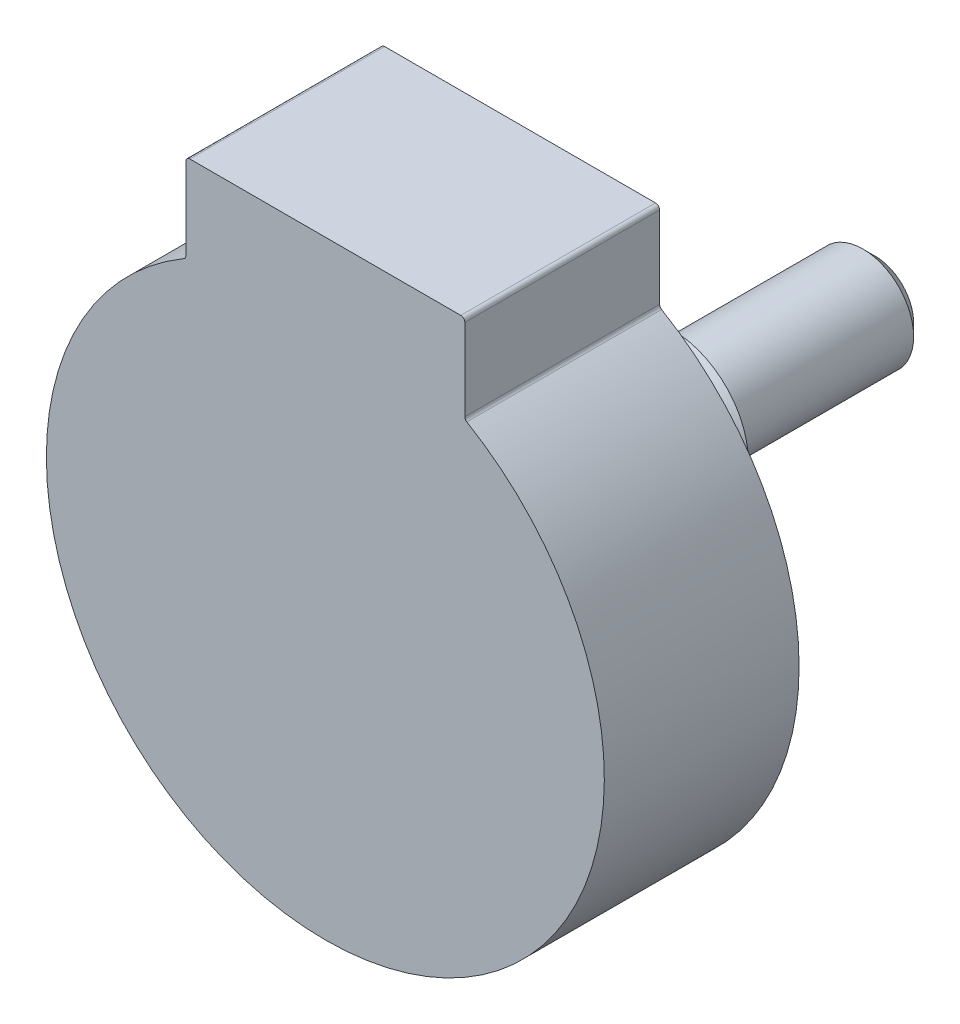
ISO-10303-21;
HEADER;
FILE_DESCRIPTION(('STEP AP214'),'2;1');
FILE_NAME('part.step','',(''),(''),'','','');
FILE_SCHEMA(('AUTOMOTIVE_DESIGN { 1 0 10303 214 1 1 1 1 }'));
ENDSEC;
DATA;
#1=APPLICATION_CONTEXT('core data for automotive mechanical design processes');
#2=APPLICATION_PROTOCOL_DEFINITION('international standard','automotive_design',2000,#1);
#3=PRODUCT_CONTEXT('',#1,'mechanical');
#4=PRODUCT('Part','Part','',(#3));
#5=PRODUCT_RELATED_PRODUCT_CATEGORY('part','',(#4));
#6=PRODUCT_DEFINITION_FORMATION('','',#4);
#7=PRODUCT_DEFINITION_CONTEXT('part definition',#1,'design');
#8=PRODUCT_DEFINITION('design','',#6,#7);
#9=PRODUCT_DEFINITION_SHAPE('','',#8);
#10=(LENGTH_UNIT() NAMED_UNIT(*) SI_UNIT(.MILLI.,.METRE.));
#11=(NAMED_UNIT(*) PLANE_ANGLE_UNIT() SI_UNIT($,.RADIAN.));
#12=(NAMED_UNIT(*) SI_UNIT($,.STERADIAN.) SOLID_ANGLE_UNIT());
#13=UNCERTAINTY_MEASURE_WITH_UNIT(LENGTH_MEASURE(1.E-05),#10,'distance_accuracy_value','');
#14=(GEOMETRIC_REPRESENTATION_CONTEXT(3) GLOBAL_UNCERTAINTY_ASSIGNED_CONTEXT((#13)) GLOBAL_UNIT_ASSIGNED_CONTEXT((#10,
#11,#12)) REPRESENTATION_CONTEXT('',''));
#15=CARTESIAN_POINT('',(0.,0.,0.));
#16=DIRECTION('',(0.,0.,1.));
#17=DIRECTION('',(1.,0.,0.));
#18=AXIS2_PLACEMENT_3D('',#15,#16,#17);
#19=CARTESIAN_POINT('',(0.,0.,0.));
#20=DIRECTION('',(0.,0.,1.));
#21=DIRECTION('',(1.,0.,0.));
#22=AXIS2_PLACEMENT_3D('',#19,#20,#21);
#23=PLANE('',#22);
#24=CARTESIAN_POINT('',(0.,0.,0.));
#25=DIRECTION('',(0.,0.,1.));
#26=DIRECTION('',(1.,0.,0.));
#27=AXIS2_PLACEMENT_3D('',#24,#25,#26);
#28=CIRCLE('',#27,4.7625);
#29=CARTESIAN_POINT('',(4.7625,0.,0.));
#30=VERTEX_POINT('',#29);
#31=EDGE_CURVE('E133',#30,#30,#28,.T.);
#32=ORIENTED_EDGE('',*,*,#31,.T.);
#33=EDGE_LOOP('',(#32));
#34=FACE_BOUND('',#33,.T.);
#35=CARTESIAN_POINT('',(-17.4625,0.,0.));
#36=DIRECTION('',(0.,0.,-1.));
#37=DIRECTION('',(-1.,0.,0.));
#38=AXIS2_PLACEMENT_3D('',#35,#36,#37);
#39=CIRCLE('',#38,3.175);
#40=CARTESIAN_POINT('',(-17.1738636363636,3.16185294559801,0.));
#41=VERTEX_POINT('',#40);
#42=CARTESIAN_POINT('',(-17.1738636363636,-3.16185294559801,0.));
#43=VERTEX_POINT('',#42);
#44=EDGE_CURVE('E51',#41,#43,#39,.T.);
#45=ORIENTED_EDGE('',*,*,#44,.F.);
#46=CARTESIAN_POINT('',(0.,0.,0.));
#47=DIRECTION('',(0.,0.,1.));
#48=DIRECTION('',(1.,0.,0.));
#49=AXIS2_PLACEMENT_3D('',#46,#47,#48);
#50=CIRCLE('',#49,17.4625);
#51=CARTESIAN_POINT('',(-8.85642921146953,15.0500022548912,0.));
#52=VERTEX_POINT('',#51);
#53=EDGE_CURVE('E132',#52,#41,#50,.T.);
#54=ORIENTED_EDGE('',*,*,#53,.F.);
#55=CARTESIAN_POINT('',(-8.98525,15.2689113785987,0.));
#56=DIRECTION('',(0.,0.,1.));
#57=DIRECTION('',(1.,0.,0.));
#58=AXIS2_PLACEMENT_3D('',#55,#56,#57);
#59=CIRCLE('',#58,0.254);
#60=CARTESIAN_POINT('',(-8.73125,15.2689113785987,0.));
#61=VERTEX_POINT('',#60);
#62=EDGE_CURVE('E268',#52,#61,#59,.T.);
#63=ORIENTED_EDGE('',*,*,#62,.T.);
#64=DIRECTION('',(0.,-1.,0.));
#65=VECTOR('',#64,1.);
#66=CARTESIAN_POINT('',(-8.73125,15.1229686135858,0.));
#67=LINE('',#66,#65);
#68=CARTESIAN_POINT('',(-8.73125,20.3835,0.));
#69=VERTEX_POINT('',#68);
#70=EDGE_CURVE('E220',#69,#61,#67,.T.);
#71=ORIENTED_EDGE('',*,*,#70,.F.);
#72=CARTESIAN_POINT('',(-8.47725,20.3835,0.));
#73=DIRECTION('',(0.,0.,1.));
#74=DIRECTION('',(1.,0.,0.));
#75=AXIS2_PLACEMENT_3D('',#72,#73,#74);
#76=CIRCLE('',#75,0.254);
#77=CARTESIAN_POINT('',(-8.47725,20.6375,0.));
#78=VERTEX_POINT('',#77);
#79=EDGE_CURVE('E249',#69,#78,#76,.F.);
#80=ORIENTED_EDGE('',*,*,#79,.T.);
#81=DIRECTION('',(-1.,0.,0.));
#82=VECTOR('',#81,1.);
#83=CARTESIAN_POINT('',(-8.73125,20.6375,0.));
#84=LINE('',#83,#82);
#85=CARTESIAN_POINT('',(8.47724999999999,20.6375,0.));
#86=VERTEX_POINT('',#85);
#87=EDGE_CURVE('E232',#86,#78,#84,.T.);
#88=ORIENTED_EDGE('',*,*,#87,.F.);
#89=CARTESIAN_POINT('',(8.47724999999999,20.3835,0.));
#90=DIRECTION('',(0.,0.,1.));
#91=DIRECTION('',(1.,0.,0.));
#92=AXIS2_PLACEMENT_3D('',#89,#90,#91);
#93=CIRCLE('',#92,0.254);
#94=CARTESIAN_POINT('',(8.73125,20.3835,0.));
#95=VERTEX_POINT('',#94);
#96=EDGE_CURVE('E247',#86,#95,#93,.F.);
#97=ORIENTED_EDGE('',*,*,#96,.T.);
#98=DIRECTION('',(0.,1.,0.));
#99=VECTOR('',#98,1.);
#100=CARTESIAN_POINT('',(8.73125,20.6375,0.));
#101=LINE('',#100,#99);
#102=CARTESIAN_POINT('',(8.73125,15.2689113785987,0.));
#103=VERTEX_POINT('',#102);
#104=EDGE_CURVE('E230',#103,#95,#101,.T.);
#105=ORIENTED_EDGE('',*,*,#104,.F.);
#106=CARTESIAN_POINT('',(8.98525,15.2689113785987,0.));
#107=DIRECTION('',(0.,0.,1.));
#108=DIRECTION('',(1.,0.,0.));
#109=AXIS2_PLACEMENT_3D('',#106,#107,#108);
#110=CIRCLE('',#109,0.254);
#111=CARTESIAN_POINT('',(8.85642921146953,15.0500022548912,0.));
#112=VERTEX_POINT('',#111);
#113=EDGE_CURVE('E44',#103,#112,#110,.T.);
#114=ORIENTED_EDGE('',*,*,#113,.T.);
#115=EDGE_CURVE('E215',#43,#112,#50,.T.);
#116=ORIENTED_EDGE('',*,*,#115,.F.);
#117=EDGE_LOOP('',(#45,#54,#63,#71,#80,#88,#97,#105,#114,#116));
#118=FACE_BOUND('',#117,.T.);
#119=ADVANCED_FACE('F36',(#34,#118),#23,.F.);
#120=CARTESIAN_POINT('',(0.,0.,12.192));
#121=DIRECTION('',(0.,0.,-1.));
#122=DIRECTION('',(-1.,0.,0.));
#123=AXIS2_PLACEMENT_3D('',#120,#121,#122);
#124=CYLINDRICAL_SURFACE('',#123,17.4625);
#125=CARTESIAN_POINT('',(0.,0.,12.192));
#126=DIRECTION('',(0.,0.,1.));
#127=DIRECTION('',(1.,0.,0.));
#128=AXIS2_PLACEMENT_3D('',#125,#126,#127);
#129=CIRCLE('',#128,17.4625);
#130=CARTESIAN_POINT('',(-8.85642921146953,15.0500022548912,12.192));
#131=VERTEX_POINT('',#130);
#132=CARTESIAN_POINT('',(8.85642921146953,15.0500022548912,12.192));
#133=VERTEX_POINT('',#132);
#134=EDGE_CURVE('E216',#131,#133,#129,.T.);
#135=ORIENTED_EDGE('',*,*,#134,.F.);
#136=DIRECTION('',(0.,0.,-1.));
#137=VECTOR('',#136,1.);
#138=CARTESIAN_POINT('',(-8.85642921146953,15.0500022548912,12.192));
#139=LINE('',#138,#137);
#140=EDGE_CURVE('E262',#131,#52,#139,.T.);
#141=ORIENTED_EDGE('',*,*,#140,.T.);
#142=ORIENTED_EDGE('',*,*,#53,.T.);
#143=DIRECTION('',(0.,0.,1.));
#144=VECTOR('',#143,1.);
#145=CARTESIAN_POINT('',(-17.1738636363636,3.16185294559801,-1.905));
#146=LINE('',#145,#144);
#147=CARTESIAN_POINT('',(-17.1738636363636,3.16185294559801,-1.905));
#148=VERTEX_POINT('',#147);
#149=EDGE_CURVE('E119',#148,#41,#146,.T.);
#150=ORIENTED_EDGE('',*,*,#149,.F.);
#151=CARTESIAN_POINT('',(0.,0.,-1.905));
#152=DIRECTION('',(0.,0.,-1.));
#153=DIRECTION('',(-1.,0.,0.));
#154=AXIS2_PLACEMENT_3D('',#151,#152,#153);
#155=CIRCLE('',#154,17.4625);
#156=CARTESIAN_POINT('',(-17.1738636363636,-3.16185294559801,-1.905));
#157=VERTEX_POINT('',#156);
#158=EDGE_CURVE('E124',#157,#148,#155,.T.);
#159=ORIENTED_EDGE('',*,*,#158,.F.);
#160=DIRECTION('',(0.,0.,1.));
#161=VECTOR('',#160,1.);
#162=CARTESIAN_POINT('',(-17.1738636363636,-3.16185294559801,-1.905));
#163=LINE('',#162,#161);
#164=EDGE_CURVE('E121',#157,#43,#163,.T.);
#165=ORIENTED_EDGE('',*,*,#164,.T.);
#166=ORIENTED_EDGE('',*,*,#115,.T.);
#167=DIRECTION('',(0.,0.,-1.));
#168=VECTOR('',#167,1.);
#169=CARTESIAN_POINT('',(8.85642921146953,15.0500022548912,12.192));
#170=LINE('',#169,#168);
#171=EDGE_CURVE('E260',#112,#133,#170,.F.);
#172=ORIENTED_EDGE('',*,*,#171,.T.);
#173=EDGE_LOOP('',(#135,#141,#142,#150,#159,#165,#166,#172));
#174=FACE_BOUND('',#173,.T.);
#175=ADVANCED_FACE('F130',(#174),#124,.T.);
#176=CARTESIAN_POINT('',(8.73125,20.6375,12.192));
#177=DIRECTION('',(-1.,0.,0.));
#178=DIRECTION('',(0.,0.,1.));
#179=AXIS2_PLACEMENT_3D('',#176,#177,#178);
#180=PLANE('',#179);
#181=DIRECTION('',(0.,1.,0.));
#182=VECTOR('',#181,1.);
#183=CARTESIAN_POINT('',(8.73125,20.6375,12.192));
#184=LINE('',#183,#182);
#185=CARTESIAN_POINT('',(8.73125,15.2689113785987,12.192));
#186=VERTEX_POINT('',#185);
#187=CARTESIAN_POINT('',(8.73125,20.3835,12.192));
#188=VERTEX_POINT('',#187);
#189=EDGE_CURVE('E219',#186,#188,#184,.T.);
#190=ORIENTED_EDGE('',*,*,#189,.F.);
#191=DIRECTION('',(0.,0.,1.));
#192=VECTOR('',#191,1.);
#193=CARTESIAN_POINT('',(8.73125,15.2689113785987,0.));
#194=LINE('',#193,#192);
#195=EDGE_CURVE('E265',#186,#103,#194,.F.);
#196=ORIENTED_EDGE('',*,*,#195,.T.);
#197=ORIENTED_EDGE('',*,*,#104,.T.);
#198=DIRECTION('',(0.,0.,-1.));
#199=VECTOR('',#198,1.);
#200=CARTESIAN_POINT('',(8.73125,20.3835,12.192));
#201=LINE('',#200,#199);
#202=EDGE_CURVE('E59',#95,#188,#201,.F.);
#203=ORIENTED_EDGE('',*,*,#202,.T.);
#204=EDGE_LOOP('',(#190,#196,#197,#203));
#205=FACE_BOUND('',#204,.T.);
#206=ADVANCED_FACE('F301',(#205),#180,.F.);
#207=CARTESIAN_POINT('',(-8.73125,20.6375,12.192));
#208=DIRECTION('',(0.,-1.,0.));
#209=DIRECTION('',(0.,0.,-1.));
#210=AXIS2_PLACEMENT_3D('',#207,#208,#209);
#211=PLANE('',#210);
#212=ORIENTED_EDGE('',*,*,#87,.T.);
#213=DIRECTION('',(0.,0.,-1.));
#214=VECTOR('',#213,1.);
#215=CARTESIAN_POINT('',(-8.47725,20.6375,12.192));
#216=LINE('',#215,#214);
#217=CARTESIAN_POINT('',(-8.47725,20.6375,12.192));
#218=VERTEX_POINT('',#217);
#219=EDGE_CURVE('E254',#78,#218,#216,.F.);
#220=ORIENTED_EDGE('',*,*,#219,.T.);
#221=DIRECTION('',(-1.,0.,0.));
#222=VECTOR('',#221,1.);
#223=CARTESIAN_POINT('',(-8.73125,20.6375,12.192));
#224=LINE('',#223,#222);
#225=CARTESIAN_POINT('',(8.47724999999999,20.6375,12.192));
#226=VERTEX_POINT('',#225);
#227=EDGE_CURVE('E222',#226,#218,#224,.T.);
#228=ORIENTED_EDGE('',*,*,#227,.F.);
#229=DIRECTION('',(0.,0.,-1.));
#230=VECTOR('',#229,1.);
#231=CARTESIAN_POINT('',(8.47724999999999,20.6375,12.192));
#232=LINE('',#231,#230);
#233=EDGE_CURVE('E251',#226,#86,#232,.T.);
#234=ORIENTED_EDGE('',*,*,#233,.T.);
#235=EDGE_LOOP('',(#212,#220,#228,#234));
#236=FACE_BOUND('',#235,.T.);
#237=ADVANCED_FACE('F296',(#236),#211,.F.);
#238=CARTESIAN_POINT('',(-8.73125,15.1229686135858,12.192));
#239=DIRECTION('',(1.,0.,0.));
#240=DIRECTION('',(0.,0.,-1.));
#241=AXIS2_PLACEMENT_3D('',#238,#239,#240);
#242=PLANE('',#241);
#243=DIRECTION('',(0.,-1.,0.));
#244=VECTOR('',#243,1.);
#245=CARTESIAN_POINT('',(-8.73125,15.1229686135858,12.192));
#246=LINE('',#245,#244);
#247=CARTESIAN_POINT('',(-8.73125,20.3835,12.192));
#248=VERTEX_POINT('',#247);
#249=CARTESIAN_POINT('',(-8.73125,15.2689113785987,12.192));
#250=VERTEX_POINT('',#249);
#251=EDGE_CURVE('E225',#248,#250,#246,.T.);
#252=ORIENTED_EDGE('',*,*,#251,.F.);
#253=DIRECTION('',(0.,0.,-1.));
#254=VECTOR('',#253,1.);
#255=CARTESIAN_POINT('',(-8.73125,20.3835,12.192));
#256=LINE('',#255,#254);
#257=EDGE_CURVE('E244',#248,#69,#256,.T.);
#258=ORIENTED_EDGE('',*,*,#257,.T.);
#259=ORIENTED_EDGE('',*,*,#70,.T.);
#260=DIRECTION('',(0.,0.,1.));
#261=VECTOR('',#260,1.);
#262=CARTESIAN_POINT('',(-8.73125,15.2689113785987,12.192));
#263=LINE('',#262,#261);
#264=EDGE_CURVE('E242',#61,#250,#263,.T.);
#265=ORIENTED_EDGE('',*,*,#264,.T.);
#266=EDGE_LOOP('',(#252,#258,#259,#265));
#267=FACE_BOUND('',#266,.T.);
#268=ADVANCED_FACE('F288',(#267),#242,.F.);
#269=CARTESIAN_POINT('',(0.,0.,12.192));
#270=DIRECTION('',(0.,0.,1.));
#271=DIRECTION('',(1.,0.,0.));
#272=AXIS2_PLACEMENT_3D('',#269,#270,#271);
#273=PLANE('',#272);
#274=ORIENTED_EDGE('',*,*,#227,.T.);
#275=CARTESIAN_POINT('',(-8.47725,20.3835,12.192));
#276=DIRECTION('',(0.,0.,1.));
#277=DIRECTION('',(1.,0.,0.));
#278=AXIS2_PLACEMENT_3D('',#275,#276,#277);
#279=CIRCLE('',#278,0.254);
#280=EDGE_CURVE('E258',#218,#248,#279,.T.);
#281=ORIENTED_EDGE('',*,*,#280,.T.);
#282=ORIENTED_EDGE('',*,*,#251,.T.);
#283=CARTESIAN_POINT('',(-8.98525,15.2689113785987,12.192));
#284=DIRECTION('',(0.,0.,1.));
#285=DIRECTION('',(1.,0.,0.));
#286=AXIS2_PLACEMENT_3D('',#283,#284,#285);
#287=CIRCLE('',#286,0.254);
#288=EDGE_CURVE('E270',#250,#131,#287,.F.);
#289=ORIENTED_EDGE('',*,*,#288,.T.);
#290=ORIENTED_EDGE('',*,*,#134,.T.);
#291=CARTESIAN_POINT('',(8.98525,15.2689113785987,12.192));
#292=DIRECTION('',(0.,0.,1.));
#293=DIRECTION('',(1.,0.,0.));
#294=AXIS2_PLACEMENT_3D('',#291,#292,#293);
#295=CIRCLE('',#294,0.254);
#296=EDGE_CURVE('E11',#133,#186,#295,.F.);
#297=ORIENTED_EDGE('',*,*,#296,.T.);
#298=ORIENTED_EDGE('',*,*,#189,.T.);
#299=CARTESIAN_POINT('',(8.47724999999999,20.3835,12.192));
#300=DIRECTION('',(0.,0.,1.));
#301=DIRECTION('',(1.,0.,0.));
#302=AXIS2_PLACEMENT_3D('',#299,#300,#301);
#303=CIRCLE('',#302,0.254);
#304=EDGE_CURVE('E256',#188,#226,#303,.T.);
#305=ORIENTED_EDGE('',*,*,#304,.T.);
#306=EDGE_LOOP('',(#274,#281,#282,#289,#290,#297,#298,#305));
#307=FACE_BOUND('',#306,.T.);
#308=ADVANCED_FACE('F280',(#307),#273,.T.);
#309=CARTESIAN_POINT('',(0.,0.,-22.225));
#310=DIRECTION('',(0.,0.,-1.));
#311=DIRECTION('',(-1.,0.,0.));
#312=AXIS2_PLACEMENT_3D('',#309,#310,#311);
#313=PLANE('',#312);
#314=CARTESIAN_POINT('',(0.,0.,-22.225));
#315=DIRECTION('',(0.,0.,-1.));
#316=DIRECTION('',(-1.,0.,0.));
#317=AXIS2_PLACEMENT_3D('',#314,#315,#316);
#318=CIRCLE('',#317,2.40665);
#319=CARTESIAN_POINT('',(-2.40665,0.,-22.225));
#320=VERTEX_POINT('',#319);
#321=EDGE_CURVE('E239',#320,#320,#318,.T.);
#322=ORIENTED_EDGE('',*,*,#321,.T.);
#323=EDGE_LOOP('',(#322));
#324=FACE_BOUND('',#323,.T.);
#325=ADVANCED_FACE('F322',(#324),#313,.T.);
#326=CARTESIAN_POINT('',(0.,0.,0.));
#327=DIRECTION('',(0.,0.,1.));
#328=DIRECTION('',(1.,0.,0.));
#329=AXIS2_PLACEMENT_3D('',#326,#327,#328);
#330=CYLINDRICAL_SURFACE('',#329,3.16865);
#331=CARTESIAN_POINT('',(0.,0.,-21.463));
#332=DIRECTION('',(0.,0.,-1.));
#333=DIRECTION('',(-1.,0.,0.));
#334=AXIS2_PLACEMENT_3D('',#331,#332,#333);
#335=CIRCLE('',#334,3.16865);
#336=CARTESIAN_POINT('',(-3.16865,0.,-21.463));
#337=VERTEX_POINT('',#336);
#338=EDGE_CURVE('E228',#337,#337,#335,.F.);
#339=ORIENTED_EDGE('',*,*,#338,.T.);
#340=EDGE_LOOP('',(#339));
#341=FACE_BOUND('',#340,.T.);
#342=CARTESIAN_POINT('',(0.,0.,-9.525));
#343=DIRECTION('',(0.,0.,1.));
#344=DIRECTION('',(1.,0.,0.));
#345=AXIS2_PLACEMENT_3D('',#342,#343,#344);
#346=CIRCLE('',#345,3.16865);
#347=CARTESIAN_POINT('',(3.16865,0.,-9.525));
#348=VERTEX_POINT('',#347);
#349=EDGE_CURVE('E212',#348,#348,#346,.T.);
#350=ORIENTED_EDGE('',*,*,#349,.F.);
#351=EDGE_LOOP('',(#350));
#352=FACE_BOUND('',#351,.T.);
#353=ADVANCED_FACE('F326',(#341,#352),#330,.T.);
#354=CARTESIAN_POINT('',(3.16865,0.,-9.525));
#355=DIRECTION('',(0.,0.,-1.));
#356=DIRECTION('',(-1.,0.,0.));
#357=AXIS2_PLACEMENT_3D('',#354,#355,#356);
#358=PLANE('',#357);
#359=ORIENTED_EDGE('',*,*,#349,.T.);
#360=EDGE_LOOP('',(#359));
#361=FACE_BOUND('',#360,.T.);
#362=CARTESIAN_POINT('',(0.,0.,-9.525));
#363=DIRECTION('',(0.,0.,1.));
#364=DIRECTION('',(1.,0.,0.));
#365=AXIS2_PLACEMENT_3D('',#362,#363,#364);
#366=CIRCLE('',#365,4.7625);
#367=CARTESIAN_POINT('',(4.7625,0.,-9.525));
#368=VERTEX_POINT('',#367);
#369=EDGE_CURVE('E209',#368,#368,#366,.T.);
#370=ORIENTED_EDGE('',*,*,#369,.F.);
#371=EDGE_LOOP('',(#370));
#372=FACE_BOUND('',#371,.T.);
#373=ADVANCED_FACE('F331',(#361,#372),#358,.T.);
#374=CARTESIAN_POINT('',(0.,0.,-9.128125));
#375=DIRECTION('',(0.,0.,-1.));
#376=DIRECTION('',(-1.,0.,0.));
#377=AXIS2_PLACEMENT_3D('',#374,#375,#376);
#378=CONICAL_SURFACE('',#377,4.318,0.841941600342267);
#379=ORIENTED_EDGE('',*,*,#369,.T.);
#380=EDGE_LOOP('',(#379));
#381=FACE_BOUND('',#380,.T.);
#382=CARTESIAN_POINT('',(0.,0.,-9.128125));
#383=DIRECTION('',(0.,0.,1.));
#384=DIRECTION('',(1.,0.,0.));
#385=AXIS2_PLACEMENT_3D('',#382,#383,#384);
#386=CIRCLE('',#385,4.318);
#387=CARTESIAN_POINT('',(4.318,0.,-9.128125));
#388=VERTEX_POINT('',#387);
#389=EDGE_CURVE('E206',#388,#388,#386,.T.);
#390=ORIENTED_EDGE('',*,*,#389,.F.);
#391=EDGE_LOOP('',(#390));
#392=FACE_BOUND('',#391,.T.);
#393=ADVANCED_FACE('F337',(#381,#392),#378,.T.);
#394=CARTESIAN_POINT('',(0.,0.,-8.73125));
#395=DIRECTION('',(0.,0.,1.));
#396=DIRECTION('',(1.,0.,0.));
#397=AXIS2_PLACEMENT_3D('',#394,#395,#396);
#398=CONICAL_SURFACE('',#397,4.7625,0.841941600342267);
#399=ORIENTED_EDGE('',*,*,#389,.T.);
#400=EDGE_LOOP('',(#399));
#401=FACE_BOUND('',#400,.T.);
#402=CARTESIAN_POINT('',(0.,0.,-8.73125));
#403=DIRECTION('',(0.,0.,1.));
#404=DIRECTION('',(1.,0.,0.));
#405=AXIS2_PLACEMENT_3D('',#402,#403,#404);
#406=CIRCLE('',#405,4.7625);
#407=CARTESIAN_POINT('',(4.7625,0.,-8.73125));
#408=VERTEX_POINT('',#407);
#409=EDGE_CURVE('E203',#408,#408,#406,.T.);
#410=ORIENTED_EDGE('',*,*,#409,.F.);
#411=EDGE_LOOP('',(#410));
#412=FACE_BOUND('',#411,.T.);
#413=ADVANCED_FACE('F341',(#401,#412),#398,.T.);
#414=CARTESIAN_POINT('',(0.,0.,-8.334375));
#415=DIRECTION('',(0.,0.,-1.));
#416=DIRECTION('',(-1.,0.,0.));
#417=AXIS2_PLACEMENT_3D('',#414,#415,#416);
#418=CONICAL_SURFACE('',#417,4.318,0.841941600342267);
#419=ORIENTED_EDGE('',*,*,#409,.T.);
#420=EDGE_LOOP('',(#419));
#421=FACE_BOUND('',#420,.T.);
#422=CARTESIAN_POINT('',(0.,0.,-8.334375));
#423=DIRECTION('',(0.,0.,1.));
#424=DIRECTION('',(1.,0.,0.));
#425=AXIS2_PLACEMENT_3D('',#422,#423,#424);
#426=CIRCLE('',#425,4.318);
#427=CARTESIAN_POINT('',(4.318,0.,-8.334375));
#428=VERTEX_POINT('',#427);
#429=EDGE_CURVE('E200',#428,#428,#426,.T.);
#430=ORIENTED_EDGE('',*,*,#429,.F.);
#431=EDGE_LOOP('',(#430));
#432=FACE_BOUND('',#431,.T.);
#433=ADVANCED_FACE('F345',(#421,#432),#418,.T.);
#434=CARTESIAN_POINT('',(0.,0.,-7.9375));
#435=DIRECTION('',(0.,0.,1.));
#436=DIRECTION('',(1.,0.,0.));
#437=AXIS2_PLACEMENT_3D('',#434,#435,#436);
#438=CONICAL_SURFACE('',#437,4.7625,0.841941600342267);
#439=ORIENTED_EDGE('',*,*,#429,.T.);
#440=EDGE_LOOP('',(#439));
#441=FACE_BOUND('',#440,.T.);
#442=CARTESIAN_POINT('',(0.,0.,-7.9375));
#443=DIRECTION('',(0.,0.,1.));
#444=DIRECTION('',(1.,0.,0.));
#445=AXIS2_PLACEMENT_3D('',#442,#443,#444);
#446=CIRCLE('',#445,4.7625);
#447=CARTESIAN_POINT('',(4.7625,0.,-7.9375));
#448=VERTEX_POINT('',#447);
#449=EDGE_CURVE('E197',#448,#448,#446,.T.);
#450=ORIENTED_EDGE('',*,*,#449,.F.);
#451=EDGE_LOOP('',(#450));
#452=FACE_BOUND('',#451,.T.);
#453=ADVANCED_FACE('F349',(#441,#452),#438,.T.);
#454=CARTESIAN_POINT('',(0.,0.,-7.540625));
#455=DIRECTION('',(0.,0.,-1.));
#456=DIRECTION('',(-1.,0.,0.));
#457=AXIS2_PLACEMENT_3D('',#454,#455,#456);
#458=CONICAL_SURFACE('',#457,4.318,0.841941600342267);
#459=ORIENTED_EDGE('',*,*,#449,.T.);
#460=EDGE_LOOP('',(#459));
#461=FACE_BOUND('',#460,.T.);
#462=CARTESIAN_POINT('',(0.,0.,-7.540625));
#463=DIRECTION('',(0.,0.,1.));
#464=DIRECTION('',(1.,0.,0.));
#465=AXIS2_PLACEMENT_3D('',#462,#463,#464);
#466=CIRCLE('',#465,4.318);
#467=CARTESIAN_POINT('',(4.318,0.,-7.540625));
#468=VERTEX_POINT('',#467);
#469=EDGE_CURVE('E194',#468,#468,#466,.T.);
#470=ORIENTED_EDGE('',*,*,#469,.F.);
#471=EDGE_LOOP('',(#470));
#472=FACE_BOUND('',#471,.T.);
#473=ADVANCED_FACE('F353',(#461,#472),#458,.T.);
#474=CARTESIAN_POINT('',(0.,0.,-7.14375));
#475=DIRECTION('',(0.,0.,1.));
#476=DIRECTION('',(1.,0.,0.));
#477=AXIS2_PLACEMENT_3D('',#474,#475,#476);
#478=CONICAL_SURFACE('',#477,4.7625,0.841941600342267);
#479=ORIENTED_EDGE('',*,*,#469,.T.);
#480=EDGE_LOOP('',(#479));
#481=FACE_BOUND('',#480,.T.);
#482=CARTESIAN_POINT('',(0.,0.,-7.14375));
#483=DIRECTION('',(0.,0.,1.));
#484=DIRECTION('',(1.,0.,0.));
#485=AXIS2_PLACEMENT_3D('',#482,#483,#484);
#486=CIRCLE('',#485,4.7625);
#487=CARTESIAN_POINT('',(4.7625,0.,-7.14375));
#488=VERTEX_POINT('',#487);
#489=EDGE_CURVE('E191',#488,#488,#486,.T.);
#490=ORIENTED_EDGE('',*,*,#489,.F.);
#491=EDGE_LOOP('',(#490));
#492=FACE_BOUND('',#491,.T.);
#493=ADVANCED_FACE('F357',(#481,#492),#478,.T.);
#494=CARTESIAN_POINT('',(0.,0.,-6.746875));
#495=DIRECTION('',(0.,0.,-1.));
#496=DIRECTION('',(-1.,0.,0.));
#497=AXIS2_PLACEMENT_3D('',#494,#495,#496);
#498=CONICAL_SURFACE('',#497,4.318,0.841941600342267);
#499=ORIENTED_EDGE('',*,*,#489,.T.);
#500=EDGE_LOOP('',(#499));
#501=FACE_BOUND('',#500,.T.);
#502=CARTESIAN_POINT('',(0.,0.,-6.746875));
#503=DIRECTION('',(0.,0.,1.));
#504=DIRECTION('',(1.,0.,0.));
#505=AXIS2_PLACEMENT_3D('',#502,#503,#504);
#506=CIRCLE('',#505,4.318);
#507=CARTESIAN_POINT('',(4.318,0.,-6.746875));
#508=VERTEX_POINT('',#507);
#509=EDGE_CURVE('E188',#508,#508,#506,.T.);
#510=ORIENTED_EDGE('',*,*,#509,.F.);
#511=EDGE_LOOP('',(#510));
#512=FACE_BOUND('',#511,.T.);
#513=ADVANCED_FACE('F361',(#501,#512),#498,.T.);
#514=CARTESIAN_POINT('',(0.,0.,-6.35));
#515=DIRECTION('',(0.,0.,1.));
#516=DIRECTION('',(1.,0.,0.));
#517=AXIS2_PLACEMENT_3D('',#514,#515,#516);
#518=CONICAL_SURFACE('',#517,4.7625,0.841941600342267);
#519=ORIENTED_EDGE('',*,*,#509,.T.);
#520=EDGE_LOOP('',(#519));
#521=FACE_BOUND('',#520,.T.);
#522=CARTESIAN_POINT('',(0.,0.,-6.35));
#523=DIRECTION('',(0.,0.,1.));
#524=DIRECTION('',(1.,0.,0.));
#525=AXIS2_PLACEMENT_3D('',#522,#523,#524);
#526=CIRCLE('',#525,4.7625);
#527=CARTESIAN_POINT('',(4.7625,0.,-6.35));
#528=VERTEX_POINT('',#527);
#529=EDGE_CURVE('E185',#528,#528,#526,.T.);
#530=ORIENTED_EDGE('',*,*,#529,.F.);
#531=EDGE_LOOP('',(#530));
#532=FACE_BOUND('',#531,.T.);
#533=ADVANCED_FACE('F365',(#521,#532),#518,.T.);
#534=CARTESIAN_POINT('',(0.,0.,-5.953125));
#535=DIRECTION('',(0.,0.,-1.));
#536=DIRECTION('',(-1.,0.,0.));
#537=AXIS2_PLACEMENT_3D('',#534,#535,#536);
#538=CONICAL_SURFACE('',#537,4.318,0.841941600342267);
#539=ORIENTED_EDGE('',*,*,#529,.T.);
#540=EDGE_LOOP('',(#539));
#541=FACE_BOUND('',#540,.T.);
#542=CARTESIAN_POINT('',(0.,0.,-5.953125));
#543=DIRECTION('',(0.,0.,1.));
#544=DIRECTION('',(1.,0.,0.));
#545=AXIS2_PLACEMENT_3D('',#542,#543,#544);
#546=CIRCLE('',#545,4.318);
#547=CARTESIAN_POINT('',(4.318,0.,-5.953125));
#548=VERTEX_POINT('',#547);
#549=EDGE_CURVE('E182',#548,#548,#546,.T.);
#550=ORIENTED_EDGE('',*,*,#549,.F.);
#551=EDGE_LOOP('',(#550));
#552=FACE_BOUND('',#551,.T.);
#553=ADVANCED_FACE('F369',(#541,#552),#538,.T.);
#554=CARTESIAN_POINT('',(0.,0.,-5.55625));
#555=DIRECTION('',(0.,0.,1.));
#556=DIRECTION('',(1.,0.,0.));
#557=AXIS2_PLACEMENT_3D('',#554,#555,#556);
#558=CONICAL_SURFACE('',#557,4.7625,0.841941600342267);
#559=ORIENTED_EDGE('',*,*,#549,.T.);
#560=EDGE_LOOP('',(#559));
#561=FACE_BOUND('',#560,.T.);
#562=CARTESIAN_POINT('',(0.,0.,-5.55625));
#563=DIRECTION('',(0.,0.,1.));
#564=DIRECTION('',(1.,0.,0.));
#565=AXIS2_PLACEMENT_3D('',#562,#563,#564);
#566=CIRCLE('',#565,4.7625);
#567=CARTESIAN_POINT('',(4.7625,0.,-5.55625));
#568=VERTEX_POINT('',#567);
#569=EDGE_CURVE('E179',#568,#568,#566,.T.);
#570=ORIENTED_EDGE('',*,*,#569,.F.);
#571=EDGE_LOOP('',(#570));
#572=FACE_BOUND('',#571,.T.);
#573=ADVANCED_FACE('F373',(#561,#572),#558,.T.);
#574=CARTESIAN_POINT('',(0.,0.,-5.159375));
#575=DIRECTION('',(0.,0.,-1.));
#576=DIRECTION('',(-1.,0.,0.));
#577=AXIS2_PLACEMENT_3D('',#574,#575,#576);
#578=CONICAL_SURFACE('',#577,4.318,0.841941600342267);
#579=ORIENTED_EDGE('',*,*,#569,.T.);
#580=EDGE_LOOP('',(#579));
#581=FACE_BOUND('',#580,.T.);
#582=CARTESIAN_POINT('',(0.,0.,-5.159375));
#583=DIRECTION('',(0.,0.,1.));
#584=DIRECTION('',(1.,0.,0.));
#585=AXIS2_PLACEMENT_3D('',#582,#583,#584);
#586=CIRCLE('',#585,4.318);
#587=CARTESIAN_POINT('',(4.318,0.,-5.159375));
#588=VERTEX_POINT('',#587);
#589=EDGE_CURVE('E176',#588,#588,#586,.T.);
#590=ORIENTED_EDGE('',*,*,#589,.F.);
#591=EDGE_LOOP('',(#590));
#592=FACE_BOUND('',#591,.T.);
#593=ADVANCED_FACE('F377',(#581,#592),#578,.T.);
#594=CARTESIAN_POINT('',(0.,0.,-4.7625));
#595=DIRECTION('',(0.,0.,1.));
#596=DIRECTION('',(1.,0.,0.));
#597=AXIS2_PLACEMENT_3D('',#594,#595,#596);
#598=CONICAL_SURFACE('',#597,4.7625,0.841941600342267);
#599=ORIENTED_EDGE('',*,*,#589,.T.);
#600=EDGE_LOOP('',(#599));
#601=FACE_BOUND('',#600,.T.);
#602=CARTESIAN_POINT('',(0.,0.,-4.7625));
#603=DIRECTION('',(0.,0.,1.));
#604=DIRECTION('',(1.,0.,0.));
#605=AXIS2_PLACEMENT_3D('',#602,#603,#604);
#606=CIRCLE('',#605,4.7625);
#607=CARTESIAN_POINT('',(4.7625,0.,-4.7625));
#608=VERTEX_POINT('',#607);
#609=EDGE_CURVE('E173',#608,#608,#606,.T.);
#610=ORIENTED_EDGE('',*,*,#609,.F.);
#611=EDGE_LOOP('',(#610));
#612=FACE_BOUND('',#611,.T.);
#613=ADVANCED_FACE('F381',(#601,#612),#598,.T.);
#614=CARTESIAN_POINT('',(0.,0.,-4.365625));
#615=DIRECTION('',(0.,0.,-1.));
#616=DIRECTION('',(-1.,0.,0.));
#617=AXIS2_PLACEMENT_3D('',#614,#615,#616);
#618=CONICAL_SURFACE('',#617,4.318,0.841941600342267);
#619=ORIENTED_EDGE('',*,*,#609,.T.);
#620=EDGE_LOOP('',(#619));
#621=FACE_BOUND('',#620,.T.);
#622=CARTESIAN_POINT('',(0.,0.,-4.365625));
#623=DIRECTION('',(0.,0.,1.));
#624=DIRECTION('',(1.,0.,0.));
#625=AXIS2_PLACEMENT_3D('',#622,#623,#624);
#626=CIRCLE('',#625,4.318);
#627=CARTESIAN_POINT('',(4.318,0.,-4.365625));
#628=VERTEX_POINT('',#627);
#629=EDGE_CURVE('E170',#628,#628,#626,.T.);
#630=ORIENTED_EDGE('',*,*,#629,.F.);
#631=EDGE_LOOP('',(#630));
#632=FACE_BOUND('',#631,.T.);
#633=ADVANCED_FACE('F385',(#621,#632),#618,.T.);
#634=CARTESIAN_POINT('',(0.,0.,-3.96875000000001));
#635=DIRECTION('',(0.,0.,1.));
#636=DIRECTION('',(1.,0.,0.));
#637=AXIS2_PLACEMENT_3D('',#634,#635,#636);
#638=CONICAL_SURFACE('',#637,4.7625,0.841941600342267);
#639=ORIENTED_EDGE('',*,*,#629,.T.);
#640=EDGE_LOOP('',(#639));
#641=FACE_BOUND('',#640,.T.);
#642=CARTESIAN_POINT('',(0.,0.,-3.96875000000001));
#643=DIRECTION('',(0.,0.,1.));
#644=DIRECTION('',(1.,0.,0.));
#645=AXIS2_PLACEMENT_3D('',#642,#643,#644);
#646=CIRCLE('',#645,4.7625);
#647=CARTESIAN_POINT('',(4.7625,0.,-3.96875000000001));
#648=VERTEX_POINT('',#647);
#649=EDGE_CURVE('E167',#648,#648,#646,.T.);
#650=ORIENTED_EDGE('',*,*,#649,.F.);
#651=EDGE_LOOP('',(#650));
#652=FACE_BOUND('',#651,.T.);
#653=ADVANCED_FACE('F389',(#641,#652),#638,.T.);
#654=CARTESIAN_POINT('',(0.,0.,-3.57187500000001));
#655=DIRECTION('',(0.,0.,-1.));
#656=DIRECTION('',(-1.,0.,0.));
#657=AXIS2_PLACEMENT_3D('',#654,#655,#656);
#658=CONICAL_SURFACE('',#657,4.318,0.841941600342267);
#659=ORIENTED_EDGE('',*,*,#649,.T.);
#660=EDGE_LOOP('',(#659));
#661=FACE_BOUND('',#660,.T.);
#662=CARTESIAN_POINT('',(0.,0.,-3.57187500000001));
#663=DIRECTION('',(0.,0.,1.));
#664=DIRECTION('',(1.,0.,0.));
#665=AXIS2_PLACEMENT_3D('',#662,#663,#664);
#666=CIRCLE('',#665,4.318);
#667=CARTESIAN_POINT('',(4.318,0.,-3.57187500000001));
#668=VERTEX_POINT('',#667);
#669=EDGE_CURVE('E164',#668,#668,#666,.T.);
#670=ORIENTED_EDGE('',*,*,#669,.F.);
#671=EDGE_LOOP('',(#670));
#672=FACE_BOUND('',#671,.T.);
#673=ADVANCED_FACE('F393',(#661,#672),#658,.T.);
#674=CARTESIAN_POINT('',(0.,0.,-3.17500000000001));
#675=DIRECTION('',(0.,0.,1.));
#676=DIRECTION('',(1.,0.,0.));
#677=AXIS2_PLACEMENT_3D('',#674,#675,#676);
#678=CONICAL_SURFACE('',#677,4.7625,0.841941600342267);
#679=ORIENTED_EDGE('',*,*,#669,.T.);
#680=EDGE_LOOP('',(#679));
#681=FACE_BOUND('',#680,.T.);
#682=CARTESIAN_POINT('',(0.,0.,-3.17500000000001));
#683=DIRECTION('',(0.,0.,1.));
#684=DIRECTION('',(1.,0.,0.));
#685=AXIS2_PLACEMENT_3D('',#682,#683,#684);
#686=CIRCLE('',#685,4.7625);
#687=CARTESIAN_POINT('',(4.7625,0.,-3.17500000000001));
#688=VERTEX_POINT('',#687);
#689=EDGE_CURVE('E161',#688,#688,#686,.T.);
#690=ORIENTED_EDGE('',*,*,#689,.F.);
#691=EDGE_LOOP('',(#690));
#692=FACE_BOUND('',#691,.T.);
#693=ADVANCED_FACE('F397',(#681,#692),#678,.T.);
#694=CARTESIAN_POINT('',(0.,0.,-2.77812500000001));
#695=DIRECTION('',(0.,0.,-1.));
#696=DIRECTION('',(-1.,0.,0.));
#697=AXIS2_PLACEMENT_3D('',#694,#695,#696);
#698=CONICAL_SURFACE('',#697,4.318,0.841941600342267);
#699=ORIENTED_EDGE('',*,*,#689,.T.);
#700=EDGE_LOOP('',(#699));
#701=FACE_BOUND('',#700,.T.);
#702=CARTESIAN_POINT('',(0.,0.,-2.77812500000001));
#703=DIRECTION('',(0.,0.,1.));
#704=DIRECTION('',(1.,0.,0.));
#705=AXIS2_PLACEMENT_3D('',#702,#703,#704);
#706=CIRCLE('',#705,4.318);
#707=CARTESIAN_POINT('',(4.318,0.,-2.77812500000001));
#708=VERTEX_POINT('',#707);
#709=EDGE_CURVE('E158',#708,#708,#706,.T.);
#710=ORIENTED_EDGE('',*,*,#709,.F.);
#711=EDGE_LOOP('',(#710));
#712=FACE_BOUND('',#711,.T.);
#713=ADVANCED_FACE('F401',(#701,#712),#698,.T.);
#714=CARTESIAN_POINT('',(0.,0.,-2.38125000000001));
#715=DIRECTION('',(0.,0.,1.));
#716=DIRECTION('',(1.,0.,0.));
#717=AXIS2_PLACEMENT_3D('',#714,#715,#716);
#718=CONICAL_SURFACE('',#717,4.7625,0.841941600342267);
#719=ORIENTED_EDGE('',*,*,#709,.T.);
#720=EDGE_LOOP('',(#719));
#721=FACE_BOUND('',#720,.T.);
#722=CARTESIAN_POINT('',(0.,0.,-2.38125000000001));
#723=DIRECTION('',(0.,0.,1.));
#724=DIRECTION('',(1.,0.,0.));
#725=AXIS2_PLACEMENT_3D('',#722,#723,#724);
#726=CIRCLE('',#725,4.7625);
#727=CARTESIAN_POINT('',(4.7625,0.,-2.38125000000001));
#728=VERTEX_POINT('',#727);
#729=EDGE_CURVE('E155',#728,#728,#726,.T.);
#730=ORIENTED_EDGE('',*,*,#729,.F.);
#731=EDGE_LOOP('',(#730));
#732=FACE_BOUND('',#731,.T.);
#733=ADVANCED_FACE('F405',(#721,#732),#718,.T.);
#734=CARTESIAN_POINT('',(0.,0.,-1.98437500000001));
#735=DIRECTION('',(0.,0.,-1.));
#736=DIRECTION('',(-1.,0.,0.));
#737=AXIS2_PLACEMENT_3D('',#734,#735,#736);
#738=CONICAL_SURFACE('',#737,4.318,0.841941600342267);
#739=ORIENTED_EDGE('',*,*,#729,.T.);
#740=EDGE_LOOP('',(#739));
#741=FACE_BOUND('',#740,.T.);
#742=CARTESIAN_POINT('',(0.,0.,-1.98437500000001));
#743=DIRECTION('',(0.,0.,1.));
#744=DIRECTION('',(1.,0.,0.));
#745=AXIS2_PLACEMENT_3D('',#742,#743,#744);
#746=CIRCLE('',#745,4.318);
#747=CARTESIAN_POINT('',(4.318,0.,-1.98437500000001));
#748=VERTEX_POINT('',#747);
#749=EDGE_CURVE('E152',#748,#748,#746,.T.);
#750=ORIENTED_EDGE('',*,*,#749,.F.);
#751=EDGE_LOOP('',(#750));
#752=FACE_BOUND('',#751,.T.);
#753=ADVANCED_FACE('F409',(#741,#752),#738,.T.);
#754=CARTESIAN_POINT('',(0.,0.,-1.58750000000001));
#755=DIRECTION('',(0.,0.,1.));
#756=DIRECTION('',(1.,0.,0.));
#757=AXIS2_PLACEMENT_3D('',#754,#755,#756);
#758=CONICAL_SURFACE('',#757,4.7625,0.841941600342267);
#759=ORIENTED_EDGE('',*,*,#749,.T.);
#760=EDGE_LOOP('',(#759));
#761=FACE_BOUND('',#760,.T.);
#762=CARTESIAN_POINT('',(0.,0.,-1.58750000000001));
#763=DIRECTION('',(0.,0.,1.));
#764=DIRECTION('',(1.,0.,0.));
#765=AXIS2_PLACEMENT_3D('',#762,#763,#764);
#766=CIRCLE('',#765,4.7625);
#767=CARTESIAN_POINT('',(4.7625,0.,-1.58750000000001));
#768=VERTEX_POINT('',#767);
#769=EDGE_CURVE('E149',#768,#768,#766,.T.);
#770=ORIENTED_EDGE('',*,*,#769,.F.);
#771=EDGE_LOOP('',(#770));
#772=FACE_BOUND('',#771,.T.);
#773=ADVANCED_FACE('F413',(#761,#772),#758,.T.);
#774=CARTESIAN_POINT('',(0.,0.,-1.19062500000001));
#775=DIRECTION('',(0.,0.,-1.));
#776=DIRECTION('',(-1.,0.,0.));
#777=AXIS2_PLACEMENT_3D('',#774,#775,#776);
#778=CONICAL_SURFACE('',#777,4.318,0.841941600342267);
#779=ORIENTED_EDGE('',*,*,#769,.T.);
#780=EDGE_LOOP('',(#779));
#781=FACE_BOUND('',#780,.T.);
#782=CARTESIAN_POINT('',(0.,0.,-1.19062500000001));
#783=DIRECTION('',(0.,0.,1.));
#784=DIRECTION('',(1.,0.,0.));
#785=AXIS2_PLACEMENT_3D('',#782,#783,#784);
#786=CIRCLE('',#785,4.318);
#787=CARTESIAN_POINT('',(4.318,0.,-1.19062500000001));
#788=VERTEX_POINT('',#787);
#789=EDGE_CURVE('E146',#788,#788,#786,.T.);
#790=ORIENTED_EDGE('',*,*,#789,.F.);
#791=EDGE_LOOP('',(#790));
#792=FACE_BOUND('',#791,.T.);
#793=ADVANCED_FACE('F417',(#781,#792),#778,.T.);
#794=CARTESIAN_POINT('',(0.,0.,-0.793750000000008));
#795=DIRECTION('',(0.,0.,1.));
#796=DIRECTION('',(1.,0.,0.));
#797=AXIS2_PLACEMENT_3D('',#794,#795,#796);
#798=CONICAL_SURFACE('',#797,4.7625,0.841941600342267);
#799=ORIENTED_EDGE('',*,*,#789,.T.);
#800=EDGE_LOOP('',(#799));
#801=FACE_BOUND('',#800,.T.);
#802=CARTESIAN_POINT('',(0.,0.,-0.793750000000008));
#803=DIRECTION('',(0.,0.,1.));
#804=DIRECTION('',(1.,0.,0.));
#805=AXIS2_PLACEMENT_3D('',#802,#803,#804);
#806=CIRCLE('',#805,4.7625);
#807=CARTESIAN_POINT('',(4.7625,0.,-0.793750000000008));
#808=VERTEX_POINT('',#807);
#809=EDGE_CURVE('E143',#808,#808,#806,.T.);
#810=ORIENTED_EDGE('',*,*,#809,.F.);
#811=EDGE_LOOP('',(#810));
#812=FACE_BOUND('',#811,.T.);
#813=ADVANCED_FACE('F421',(#801,#812),#798,.T.);
#814=CARTESIAN_POINT('',(0.,0.,-0.396875000000004));
#815=DIRECTION('',(0.,0.,-1.));
#816=DIRECTION('',(-1.,0.,0.));
#817=AXIS2_PLACEMENT_3D('',#814,#815,#816);
#818=CONICAL_SURFACE('',#817,4.31799999999999,0.841941600342267);
#819=ORIENTED_EDGE('',*,*,#809,.T.);
#820=EDGE_LOOP('',(#819));
#821=FACE_BOUND('',#820,.T.);
#822=CARTESIAN_POINT('',(0.,0.,-0.396875000000004));
#823=DIRECTION('',(0.,0.,1.));
#824=DIRECTION('',(1.,0.,0.));
#825=AXIS2_PLACEMENT_3D('',#822,#823,#824);
#826=CIRCLE('',#825,4.31799999999999);
#827=CARTESIAN_POINT('',(4.31799999999999,0.,-0.396875000000004));
#828=VERTEX_POINT('',#827);
#829=EDGE_CURVE('E136',#828,#828,#826,.T.);
#830=ORIENTED_EDGE('',*,*,#829,.F.);
#831=EDGE_LOOP('',(#830));
#832=FACE_BOUND('',#831,.T.);
#833=ADVANCED_FACE('F425',(#821,#832),#818,.T.);
#834=CARTESIAN_POINT('',(0.,0.,0.));
#835=DIRECTION('',(0.,0.,1.));
#836=DIRECTION('',(1.,0.,0.));
#837=AXIS2_PLACEMENT_3D('',#834,#835,#836);
#838=CONICAL_SURFACE('',#837,4.7625,0.841941600342267);
#839=ORIENTED_EDGE('',*,*,#829,.T.);
#840=EDGE_LOOP('',(#839));
#841=FACE_BOUND('',#840,.T.);
#842=ORIENTED_EDGE('',*,*,#31,.F.);
#843=EDGE_LOOP('',(#842));
#844=FACE_BOUND('',#843,.T.);
#845=ADVANCED_FACE('F429',(#841,#844),#838,.T.);
#846=CARTESIAN_POINT('',(0.,0.,-21.463));
#847=DIRECTION('',(0.,0.,1.));
#848=DIRECTION('',(1.,0.,0.));
#849=AXIS2_PLACEMENT_3D('',#846,#847,#848);
#850=CONICAL_SURFACE('',#849,3.16865,0.785398163397447);
#851=ORIENTED_EDGE('',*,*,#321,.F.);
#852=EDGE_LOOP('',(#851));
#853=FACE_BOUND('',#852,.T.);
#854=ORIENTED_EDGE('',*,*,#338,.F.);
#855=EDGE_LOOP('',(#854));
#856=FACE_BOUND('',#855,.T.);
#857=ADVANCED_FACE('F433',(#853,#856),#850,.T.);
#858=CARTESIAN_POINT('',(-8.47725,20.3835,12.192));
#859=DIRECTION('',(0.,0.,-1.));
#860=DIRECTION('',(-1.,0.,0.));
#861=AXIS2_PLACEMENT_3D('',#858,#859,#860);
#862=CYLINDRICAL_SURFACE('',#861,0.254);
#863=ORIENTED_EDGE('',*,*,#280,.F.);
#864=ORIENTED_EDGE('',*,*,#219,.F.);
#865=ORIENTED_EDGE('',*,*,#79,.F.);
#866=ORIENTED_EDGE('',*,*,#257,.F.);
#867=EDGE_LOOP('',(#863,#864,#865,#866));
#868=FACE_BOUND('',#867,.T.);
#869=ADVANCED_FACE('F292',(#868),#862,.T.);
#870=CARTESIAN_POINT('',(-8.98525,15.2689113785987,12.192));
#871=DIRECTION('',(0.,0.,-1.));
#872=DIRECTION('',(-1.,0.,0.));
#873=AXIS2_PLACEMENT_3D('',#870,#871,#872);
#874=CYLINDRICAL_SURFACE('',#873,0.254);
#875=ORIENTED_EDGE('',*,*,#288,.F.);
#876=ORIENTED_EDGE('',*,*,#264,.F.);
#877=ORIENTED_EDGE('',*,*,#62,.F.);
#878=ORIENTED_EDGE('',*,*,#140,.F.);
#879=EDGE_LOOP('',(#875,#876,#877,#878));
#880=FACE_BOUND('',#879,.T.);
#881=ADVANCED_FACE('F285',(#880),#874,.F.);
#882=CARTESIAN_POINT('',(8.98525,15.2689113785987,12.192));
#883=DIRECTION('',(0.,0.,-1.));
#884=DIRECTION('',(-1.,0.,0.));
#885=AXIS2_PLACEMENT_3D('',#882,#883,#884);
#886=CYLINDRICAL_SURFACE('',#885,0.254);
#887=ORIENTED_EDGE('',*,*,#296,.F.);
#888=ORIENTED_EDGE('',*,*,#171,.F.);
#889=ORIENTED_EDGE('',*,*,#113,.F.);
#890=ORIENTED_EDGE('',*,*,#195,.F.);
#891=EDGE_LOOP('',(#887,#888,#889,#890));
#892=FACE_BOUND('',#891,.T.);
#893=ADVANCED_FACE('F277',(#892),#886,.F.);
#894=CARTESIAN_POINT('',(8.47724999999999,20.3835,12.192));
#895=DIRECTION('',(0.,0.,-1.));
#896=DIRECTION('',(-1.,0.,0.));
#897=AXIS2_PLACEMENT_3D('',#894,#895,#896);
#898=CYLINDRICAL_SURFACE('',#897,0.254);
#899=ORIENTED_EDGE('',*,*,#304,.F.);
#900=ORIENTED_EDGE('',*,*,#202,.F.);
#901=ORIENTED_EDGE('',*,*,#96,.F.);
#902=ORIENTED_EDGE('',*,*,#233,.F.);
#903=EDGE_LOOP('',(#899,#900,#901,#902));
#904=FACE_BOUND('',#903,.T.);
#905=ADVANCED_FACE('F38',(#904),#898,.T.);
#906=CARTESIAN_POINT('',(-17.4625,0.,-1.905));
#907=DIRECTION('',(0.,0.,1.));
#908=DIRECTION('',(1.,0.,0.));
#909=AXIS2_PLACEMENT_3D('',#906,#907,#908);
#910=CYLINDRICAL_SURFACE('',#909,3.175);
#911=ORIENTED_EDGE('',*,*,#44,.T.);
#912=ORIENTED_EDGE('',*,*,#164,.F.);
#913=CARTESIAN_POINT('',(-17.4625,0.,-1.905));
#914=DIRECTION('',(0.,0.,-1.));
#915=DIRECTION('',(-1.,0.,0.));
#916=AXIS2_PLACEMENT_3D('',#913,#914,#915);
#917=CIRCLE('',#916,3.175);
#918=EDGE_CURVE('E115',#148,#157,#917,.T.);
#919=ORIENTED_EDGE('',*,*,#918,.F.);
#920=ORIENTED_EDGE('',*,*,#149,.T.);
#921=EDGE_LOOP('',(#911,#912,#919,#920));
#922=FACE_BOUND('',#921,.T.);
#923=ADVANCED_FACE('F117',(#922),#910,.T.);
#924=CARTESIAN_POINT('',(-8.73125,0.,-1.905));
#925=DIRECTION('',(0.,0.,-1.));
#926=DIRECTION('',(-1.,0.,0.));
#927=AXIS2_PLACEMENT_3D('',#924,#925,#926);
#928=PLANE('',#927);
#929=ORIENTED_EDGE('',*,*,#158,.T.);
#930=ORIENTED_EDGE('',*,*,#918,.T.);
#931=EDGE_LOOP('',(#929,#930));
#932=FACE_BOUND('',#931,.T.);
#933=ADVANCED_FACE('F126',(#932),#928,.T.);
#934=CLOSED_SHELL('',(#119,#175,#206,#237,#268,#308,#325,#353,#373,#393,#413,#433,#453,#473,
#493,#513,#533,#553,#573,#593,#613,#633,#653,#673,#693,#713,#733,#753,#773,#793,#813,#833,#845,
#857,#869,#881,#893,#905,#923,#933));
#935=MANIFOLD_SOLID_BREP('B2',#934);
#936=ADVANCED_BREP_SHAPE_REPRESENTATION('',(#18,#935),#14);
#937=SHAPE_DEFINITION_REPRESENTATION(#9,#936);
ENDSEC;
END-ISO-10303-21;
